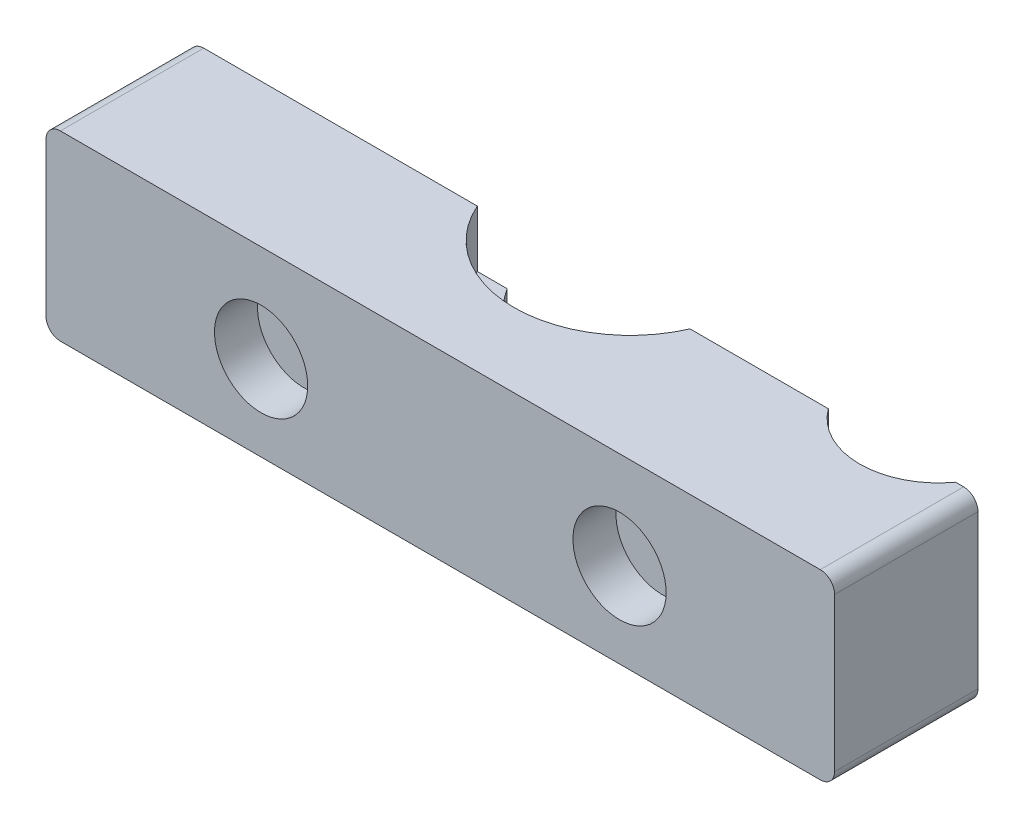
ISO-10303-21;
HEADER;
FILE_DESCRIPTION(('STEP AP214'),'2;1');
FILE_NAME('part.step','',(''),(''),'','','');
FILE_SCHEMA(('AUTOMOTIVE_DESIGN { 1 0 10303 214 1 1 1 1 }'));
ENDSEC;
DATA;
#1=APPLICATION_CONTEXT('core data for automotive mechanical design processes');
#2=APPLICATION_PROTOCOL_DEFINITION('international standard','automotive_design',2000,#1);
#3=PRODUCT_CONTEXT('',#1,'mechanical');
#4=PRODUCT('Part','Part','',(#3));
#5=PRODUCT_RELATED_PRODUCT_CATEGORY('part','',(#4));
#6=PRODUCT_DEFINITION_FORMATION('','',#4);
#7=PRODUCT_DEFINITION_CONTEXT('part definition',#1,'design');
#8=PRODUCT_DEFINITION('design','',#6,#7);
#9=PRODUCT_DEFINITION_SHAPE('','',#8);
#10=(LENGTH_UNIT() NAMED_UNIT(*) SI_UNIT(.MILLI.,.METRE.));
#11=(NAMED_UNIT(*) PLANE_ANGLE_UNIT() SI_UNIT($,.RADIAN.));
#12=(NAMED_UNIT(*) SI_UNIT($,.STERADIAN.) SOLID_ANGLE_UNIT());
#13=UNCERTAINTY_MEASURE_WITH_UNIT(LENGTH_MEASURE(1.E-05),#10,'distance_accuracy_value','');
#14=(GEOMETRIC_REPRESENTATION_CONTEXT(3) GLOBAL_UNCERTAINTY_ASSIGNED_CONTEXT((#13)) GLOBAL_UNIT_ASSIGNED_CONTEXT((#10,
#11,#12)) REPRESENTATION_CONTEXT('',''));
#15=CARTESIAN_POINT('',(0.,0.,0.));
#16=DIRECTION('',(0.,0.,1.));
#17=DIRECTION('',(1.,0.,0.));
#18=AXIS2_PLACEMENT_3D('',#15,#16,#17);
#19=CARTESIAN_POINT('',(26.5,-4.925,0.));
#20=DIRECTION('',(0.,0.,1.));
#21=DIRECTION('',(0.70710678118655,-0.707106781186546,0.));
#22=AXIS2_PLACEMENT_3D('',#19,#20,#21);
#23=CYLINDRICAL_SURFACE('',#22,1.);
#24=CARTESIAN_POINT('',(26.5,-4.925,10.));
#25=DIRECTION('',(0.,0.,-1.));
#26=DIRECTION('',(0.70710678118655,-0.707106781186546,0.));
#27=AXIS2_PLACEMENT_3D('',#24,#25,#26);
#28=CIRCLE('',#27,1.);
#29=CARTESIAN_POINT('',(27.5,-4.925,10.));
#30=VERTEX_POINT('',#29);
#31=CARTESIAN_POINT('',(26.5,-5.925,10.));
#32=VERTEX_POINT('',#31);
#33=EDGE_CURVE('E11',#30,#32,#28,.T.);
#34=ORIENTED_EDGE('',*,*,#33,.T.);
#35=DIRECTION('',(0.,0.,-1.));
#36=VECTOR('',#35,1.);
#37=CARTESIAN_POINT('',(26.5,-5.925,0.));
#38=LINE('',#37,#36);
#39=CARTESIAN_POINT('',(26.5,-5.925,0.));
#40=VERTEX_POINT('',#39);
#41=EDGE_CURVE('E27',#32,#40,#38,.T.);
#42=ORIENTED_EDGE('',*,*,#41,.T.);
#43=CARTESIAN_POINT('',(26.5,-4.925,0.));
#44=DIRECTION('',(0.,0.,1.));
#45=DIRECTION('',(0.70710678118655,-0.707106781186546,0.));
#46=AXIS2_PLACEMENT_3D('',#43,#44,#45);
#47=CIRCLE('',#46,1.);
#48=CARTESIAN_POINT('',(27.5,-4.925,0.));
#49=VERTEX_POINT('',#48);
#50=EDGE_CURVE('E398',#40,#49,#47,.T.);
#51=ORIENTED_EDGE('',*,*,#50,.T.);
#52=DIRECTION('',(0.,0.,1.));
#53=VECTOR('',#52,1.);
#54=CARTESIAN_POINT('',(27.5,-4.925,0.));
#55=LINE('',#54,#53);
#56=EDGE_CURVE('E193',#49,#30,#55,.T.);
#57=ORIENTED_EDGE('',*,*,#56,.T.);
#58=EDGE_LOOP('',(#34,#42,#51,#57));
#59=FACE_BOUND('',#58,.T.);
#60=ADVANCED_FACE('F17',(#59),#23,.T.);
#61=CARTESIAN_POINT('',(27.5,-5.925,0.));
#62=DIRECTION('',(1.,0.,0.));
#63=DIRECTION('',(0.,0.707106781186548,0.707106781186548));
#64=AXIS2_PLACEMENT_3D('',#61,#62,#63);
#65=PLANE('',#64);
#66=ORIENTED_EDGE('',*,*,#56,.F.);
#67=DIRECTION('',(0.,-1.,0.));
#68=VECTOR('',#67,1.);
#69=CARTESIAN_POINT('',(27.5,6.775,0.));
#70=LINE('',#69,#68);
#71=CARTESIAN_POINT('',(27.5,5.775,0.));
#72=VERTEX_POINT('',#71);
#73=EDGE_CURVE('E200',#72,#49,#70,.T.);
#74=ORIENTED_EDGE('',*,*,#73,.F.);
#75=DIRECTION('',(0.,0.,-1.));
#76=VECTOR('',#75,1.);
#77=CARTESIAN_POINT('',(27.5,5.775,0.));
#78=LINE('',#77,#76);
#79=CARTESIAN_POINT('',(27.5,5.775,10.));
#80=VERTEX_POINT('',#79);
#81=EDGE_CURVE('E188',#80,#72,#78,.T.);
#82=ORIENTED_EDGE('',*,*,#81,.F.);
#83=DIRECTION('',(0.,1.,0.));
#84=VECTOR('',#83,1.);
#85=CARTESIAN_POINT('',(27.5,6.775,10.));
#86=LINE('',#85,#84);
#87=EDGE_CURVE('E174',#30,#80,#86,.T.);
#88=ORIENTED_EDGE('',*,*,#87,.F.);
#89=EDGE_LOOP('',(#66,#74,#82,#88));
#90=FACE_BOUND('',#89,.T.);
#91=ADVANCED_FACE('F321',(#90),#65,.T.);
#92=CARTESIAN_POINT('',(0.,0.425,0.));
#93=DIRECTION('',(0.,0.,1.));
#94=DIRECTION('',(0.707106781186548,0.707106781186548,0.));
#95=AXIS2_PLACEMENT_3D('',#92,#93,#94);
#96=PLANE('',#95);
#97=ORIENTED_EDGE('',*,*,#50,.F.);
#98=DIRECTION('',(-1.,0.,0.));
#99=VECTOR('',#98,1.);
#100=CARTESIAN_POINT('',(27.5,-5.925,0.));
#101=LINE('',#100,#99);
#102=CARTESIAN_POINT('',(25.9370598373247,-5.925,0.));
#103=VERTEX_POINT('',#102);
#104=EDGE_CURVE('E190',#40,#103,#101,.T.);
#105=ORIENTED_EDGE('',*,*,#104,.T.);
#106=DIRECTION('',(0.,1.,0.));
#107=VECTOR('',#106,1.);
#108=CARTESIAN_POINT('',(25.9370598373247,6.775,0.));
#109=LINE('',#108,#107);
#110=CARTESIAN_POINT('',(25.9370598373247,6.775,0.));
#111=VERTEX_POINT('',#110);
#112=EDGE_CURVE('E194',#103,#111,#109,.T.);
#113=ORIENTED_EDGE('',*,*,#112,.T.);
#114=DIRECTION('',(1.,0.,0.));
#115=VECTOR('',#114,1.);
#116=CARTESIAN_POINT('',(-27.5,6.775,0.));
#117=LINE('',#116,#115);
#118=CARTESIAN_POINT('',(26.5,6.775,0.));
#119=VERTEX_POINT('',#118);
#120=EDGE_CURVE('E197',#111,#119,#117,.T.);
#121=ORIENTED_EDGE('',*,*,#120,.T.);
#122=CARTESIAN_POINT('',(26.5,5.775,0.));
#123=DIRECTION('',(0.,0.,1.));
#124=DIRECTION('',(0.707106781186546,0.707106781186549,0.));
#125=AXIS2_PLACEMENT_3D('',#122,#123,#124);
#126=CIRCLE('',#125,1.);
#127=EDGE_CURVE('E201',#72,#119,#126,.T.);
#128=ORIENTED_EDGE('',*,*,#127,.F.);
#129=ORIENTED_EDGE('',*,*,#73,.T.);
#130=EDGE_LOOP('',(#97,#105,#113,#121,#128,#129));
#131=FACE_BOUND('',#130,.T.);
#132=ADVANCED_FACE('F327',(#131),#96,.F.);
#133=CARTESIAN_POINT('',(26.5,5.775,0.));
#134=DIRECTION('',(0.,0.,1.));
#135=DIRECTION('',(0.707106781186546,0.707106781186549,0.));
#136=AXIS2_PLACEMENT_3D('',#133,#134,#135);
#137=CYLINDRICAL_SURFACE('',#136,1.);
#138=CARTESIAN_POINT('',(26.5,5.775,10.));
#139=DIRECTION('',(0.,0.,-1.));
#140=DIRECTION('',(0.707106781186546,0.707106781186549,0.));
#141=AXIS2_PLACEMENT_3D('',#138,#139,#140);
#142=CIRCLE('',#141,1.);
#143=CARTESIAN_POINT('',(26.5,6.775,10.));
#144=VERTEX_POINT('',#143);
#145=EDGE_CURVE('E204',#144,#80,#142,.T.);
#146=ORIENTED_EDGE('',*,*,#145,.T.);
#147=ORIENTED_EDGE('',*,*,#81,.T.);
#148=ORIENTED_EDGE('',*,*,#127,.T.);
#149=DIRECTION('',(0.,0.,1.));
#150=VECTOR('',#149,1.);
#151=CARTESIAN_POINT('',(26.5,6.775,0.));
#152=LINE('',#151,#150);
#153=EDGE_CURVE('E203',#119,#144,#152,.T.);
#154=ORIENTED_EDGE('',*,*,#153,.T.);
#155=EDGE_LOOP('',(#146,#147,#148,#154));
#156=FACE_BOUND('',#155,.T.);
#157=ADVANCED_FACE('F333',(#156),#137,.T.);
#158=CARTESIAN_POINT('',(-26.5,-4.925,0.));
#159=DIRECTION('',(0.,0.,1.));
#160=DIRECTION('',(-0.707106781186547,-0.707106781186549,0.));
#161=AXIS2_PLACEMENT_3D('',#158,#159,#160);
#162=CYLINDRICAL_SURFACE('',#161,1.);
#163=CARTESIAN_POINT('',(-26.5,-4.925,10.));
#164=DIRECTION('',(0.,0.,-1.));
#165=DIRECTION('',(-0.707106781186547,-0.707106781186549,0.));
#166=AXIS2_PLACEMENT_3D('',#163,#164,#165);
#167=CIRCLE('',#166,1.);
#168=CARTESIAN_POINT('',(-26.5,-5.925,10.));
#169=VERTEX_POINT('',#168);
#170=CARTESIAN_POINT('',(-27.5,-4.925,10.));
#171=VERTEX_POINT('',#170);
#172=EDGE_CURVE('E208',#169,#171,#167,.T.);
#173=ORIENTED_EDGE('',*,*,#172,.T.);
#174=DIRECTION('',(0.,0.,-1.));
#175=VECTOR('',#174,1.);
#176=CARTESIAN_POINT('',(-27.5,-4.925,0.));
#177=LINE('',#176,#175);
#178=CARTESIAN_POINT('',(-27.5,-4.925,0.));
#179=VERTEX_POINT('',#178);
#180=EDGE_CURVE('E211',#171,#179,#177,.T.);
#181=ORIENTED_EDGE('',*,*,#180,.T.);
#182=CARTESIAN_POINT('',(-26.5,-4.925,0.));
#183=DIRECTION('',(0.,0.,1.));
#184=DIRECTION('',(-0.707106781186547,-0.707106781186549,0.));
#185=AXIS2_PLACEMENT_3D('',#182,#183,#184);
#186=CIRCLE('',#185,1.);
#187=CARTESIAN_POINT('',(-26.5,-5.925,0.));
#188=VERTEX_POINT('',#187);
#189=EDGE_CURVE('E214',#179,#188,#186,.T.);
#190=ORIENTED_EDGE('',*,*,#189,.T.);
#191=DIRECTION('',(0.,0.,1.));
#192=VECTOR('',#191,1.);
#193=CARTESIAN_POINT('',(-26.5,-5.925,0.));
#194=LINE('',#193,#192);
#195=EDGE_CURVE('E217',#188,#169,#194,.T.);
#196=ORIENTED_EDGE('',*,*,#195,.T.);
#197=EDGE_LOOP('',(#173,#181,#190,#196));
#198=FACE_BOUND('',#197,.T.);
#199=ADVANCED_FACE('F337',(#198),#162,.T.);
#200=CARTESIAN_POINT('',(-27.5,-5.925,0.));
#201=DIRECTION('',(0.,-1.,0.));
#202=DIRECTION('',(0.707106781186548,0.,0.707106781186548));
#203=AXIS2_PLACEMENT_3D('',#200,#201,#202);
#204=PLANE('',#203);
#205=ORIENTED_EDGE('',*,*,#41,.F.);
#206=DIRECTION('',(1.,0.,0.));
#207=VECTOR('',#206,1.);
#208=CARTESIAN_POINT('',(27.5,-5.925,10.));
#209=LINE('',#208,#207);
#210=EDGE_CURVE('E159',#169,#32,#209,.T.);
#211=ORIENTED_EDGE('',*,*,#210,.F.);
#212=ORIENTED_EDGE('',*,*,#195,.F.);
#213=DIRECTION('',(-1.,0.,0.));
#214=VECTOR('',#213,1.);
#215=CARTESIAN_POINT('',(27.5,-5.925,0.));
#216=LINE('',#215,#214);
#217=CARTESIAN_POINT('',(-7.41940024530285,-5.925,0.));
#218=VERTEX_POINT('',#217);
#219=EDGE_CURVE('E222',#218,#188,#216,.T.);
#220=ORIENTED_EDGE('',*,*,#219,.F.);
#221=CARTESIAN_POINT('',(0.,-5.925,-3.25));
#222=DIRECTION('',(0.,1.,0.));
#223=DIRECTION('',(1.,0.,0.));
#224=AXIS2_PLACEMENT_3D('',#221,#222,#223);
#225=CIRCLE('',#224,8.1);
#226=CARTESIAN_POINT('',(7.41940024530285,-5.925,0.));
#227=VERTEX_POINT('',#226);
#228=EDGE_CURVE('E219',#218,#227,#225,.T.);
#229=ORIENTED_EDGE('',*,*,#228,.T.);
#230=DIRECTION('',(-1.,0.,0.));
#231=VECTOR('',#230,1.);
#232=CARTESIAN_POINT('',(27.5,-5.925,0.));
#233=LINE('',#232,#231);
#234=CARTESIAN_POINT('',(17.0629401626753,-5.925,0.));
#235=VERTEX_POINT('',#234);
#236=EDGE_CURVE('E230',#235,#227,#233,.T.);
#237=ORIENTED_EDGE('',*,*,#236,.F.);
#238=CARTESIAN_POINT('',(21.5,-5.925,-3.25));
#239=DIRECTION('',(0.,1.,0.));
#240=DIRECTION('',(-1.,0.,0.));
#241=AXIS2_PLACEMENT_3D('',#238,#239,#240);
#242=CIRCLE('',#241,5.5);
#243=EDGE_CURVE('E229',#235,#103,#242,.T.);
#244=ORIENTED_EDGE('',*,*,#243,.T.);
#245=ORIENTED_EDGE('',*,*,#104,.F.);
#246=EDGE_LOOP('',(#205,#211,#212,#220,#229,#237,#244,#245));
#247=FACE_BOUND('',#246,.T.);
#248=ADVANCED_FACE('F341',(#247),#204,.T.);
#249=CARTESIAN_POINT('',(0.,0.425,0.));
#250=DIRECTION('',(0.,0.,1.));
#251=DIRECTION('',(0.707106781186548,0.707106781186548,0.));
#252=AXIS2_PLACEMENT_3D('',#249,#250,#251);
#253=PLANE('',#252);
#254=CARTESIAN_POINT('',(-12.5,0.,0.));
#255=DIRECTION('',(0.,0.,1.));
#256=DIRECTION('',(1.,0.,0.));
#257=AXIS2_PLACEMENT_3D('',#254,#255,#256);
#258=CIRCLE('',#257,1.75);
#259=CARTESIAN_POINT('',(-14.25,0.,0.));
#260=VERTEX_POINT('',#259);
#261=EDGE_CURVE('E236',#260,#260,#258,.T.);
#262=ORIENTED_EDGE('',*,*,#261,.T.);
#263=EDGE_LOOP('',(#262));
#264=FACE_BOUND('',#263,.T.);
#265=ORIENTED_EDGE('',*,*,#189,.F.);
#266=DIRECTION('',(0.,1.,0.));
#267=VECTOR('',#266,1.);
#268=CARTESIAN_POINT('',(-27.5,-5.925,0.));
#269=LINE('',#268,#267);
#270=CARTESIAN_POINT('',(-27.5,5.775,0.));
#271=VERTEX_POINT('',#270);
#272=EDGE_CURVE('E239',#179,#271,#269,.T.);
#273=ORIENTED_EDGE('',*,*,#272,.T.);
#274=CARTESIAN_POINT('',(-26.5,5.775,0.));
#275=DIRECTION('',(0.,0.,1.));
#276=DIRECTION('',(-0.707106781186547,0.707106781186548,0.));
#277=AXIS2_PLACEMENT_3D('',#274,#275,#276);
#278=CIRCLE('',#277,1.);
#279=CARTESIAN_POINT('',(-26.5,6.775,0.));
#280=VERTEX_POINT('',#279);
#281=EDGE_CURVE('E243',#280,#271,#278,.T.);
#282=ORIENTED_EDGE('',*,*,#281,.F.);
#283=DIRECTION('',(1.,0.,0.));
#284=VECTOR('',#283,1.);
#285=CARTESIAN_POINT('',(-27.5,6.775,0.));
#286=LINE('',#285,#284);
#287=CARTESIAN_POINT('',(-7.41940024530285,6.775,0.));
#288=VERTEX_POINT('',#287);
#289=EDGE_CURVE('E242',#280,#288,#286,.T.);
#290=ORIENTED_EDGE('',*,*,#289,.T.);
#291=DIRECTION('',(0.,-1.,0.));
#292=VECTOR('',#291,1.);
#293=CARTESIAN_POINT('',(-7.41940024530285,4.8,0.));
#294=LINE('',#293,#292);
#295=CARTESIAN_POINT('',(-7.41940024530286,2.825,0.));
#296=VERTEX_POINT('',#295);
#297=EDGE_CURVE('E249',#288,#296,#294,.T.);
#298=ORIENTED_EDGE('',*,*,#297,.T.);
#299=DIRECTION('',(1.,0.,0.));
#300=VECTOR('',#299,1.);
#301=CARTESIAN_POINT('',(3.125,2.825,0.));
#302=LINE('',#301,#300);
#303=CARTESIAN_POINT('',(-5.33853912601566,2.825,0.));
#304=VERTEX_POINT('',#303);
#305=EDGE_CURVE('E252',#296,#304,#302,.T.);
#306=ORIENTED_EDGE('',*,*,#305,.T.);
#307=DIRECTION('',(0.,-1.,0.));
#308=VECTOR('',#307,1.);
#309=CARTESIAN_POINT('',(-5.33853912601566,0.,0.));
#310=LINE('',#309,#308);
#311=CARTESIAN_POINT('',(-5.33853912601566,-2.825,0.));
#312=VERTEX_POINT('',#311);
#313=EDGE_CURVE('E255',#304,#312,#310,.T.);
#314=ORIENTED_EDGE('',*,*,#313,.T.);
#315=DIRECTION('',(-1.,0.,0.));
#316=VECTOR('',#315,1.);
#317=CARTESIAN_POINT('',(4.05,-2.825,0.));
#318=LINE('',#317,#316);
#319=CARTESIAN_POINT('',(-7.41940024530285,-2.825,0.));
#320=VERTEX_POINT('',#319);
#321=EDGE_CURVE('E258',#312,#320,#318,.T.);
#322=ORIENTED_EDGE('',*,*,#321,.T.);
#323=DIRECTION('',(0.,-1.,0.));
#324=VECTOR('',#323,1.);
#325=CARTESIAN_POINT('',(-7.41940024530285,-4.375,0.));
#326=LINE('',#325,#324);
#327=EDGE_CURVE('E225',#320,#218,#326,.T.);
#328=ORIENTED_EDGE('',*,*,#327,.T.);
#329=ORIENTED_EDGE('',*,*,#219,.T.);
#330=EDGE_LOOP('',(#265,#273,#282,#290,#298,#306,#314,#322,#328,#329));
#331=FACE_BOUND('',#330,.T.);
#332=ADVANCED_FACE('F345',(#264,#331),#253,.F.);
#333=CARTESIAN_POINT('',(-26.5,5.775,0.));
#334=DIRECTION('',(0.,0.,1.));
#335=DIRECTION('',(-0.707106781186547,0.707106781186548,0.));
#336=AXIS2_PLACEMENT_3D('',#333,#334,#335);
#337=CYLINDRICAL_SURFACE('',#336,1.);
#338=CARTESIAN_POINT('',(-26.5,5.775,10.));
#339=DIRECTION('',(0.,0.,-1.));
#340=DIRECTION('',(-0.707106781186547,0.707106781186548,0.));
#341=AXIS2_PLACEMENT_3D('',#338,#339,#340);
#342=CIRCLE('',#341,1.);
#343=CARTESIAN_POINT('',(-27.5,5.775,10.));
#344=VERTEX_POINT('',#343);
#345=CARTESIAN_POINT('',(-26.5,6.775,10.));
#346=VERTEX_POINT('',#345);
#347=EDGE_CURVE('E226',#344,#346,#342,.T.);
#348=ORIENTED_EDGE('',*,*,#347,.T.);
#349=DIRECTION('',(0.,0.,-1.));
#350=VECTOR('',#349,1.);
#351=CARTESIAN_POINT('',(-26.5,6.775,0.));
#352=LINE('',#351,#350);
#353=EDGE_CURVE('E245',#346,#280,#352,.T.);
#354=ORIENTED_EDGE('',*,*,#353,.T.);
#355=ORIENTED_EDGE('',*,*,#281,.T.);
#356=DIRECTION('',(0.,0.,1.));
#357=VECTOR('',#356,1.);
#358=CARTESIAN_POINT('',(-27.5,5.775,0.));
#359=LINE('',#358,#357);
#360=EDGE_CURVE('E246',#271,#344,#359,.T.);
#361=ORIENTED_EDGE('',*,*,#360,.T.);
#362=EDGE_LOOP('',(#348,#354,#355,#361));
#363=FACE_BOUND('',#362,.T.);
#364=ADVANCED_FACE('F348',(#363),#337,.T.);
#365=CARTESIAN_POINT('',(27.5,6.775,0.));
#366=DIRECTION('',(0.,1.,0.));
#367=DIRECTION('',(0.707106781186548,0.,0.707106781186548));
#368=AXIS2_PLACEMENT_3D('',#365,#366,#367);
#369=PLANE('',#368);
#370=ORIENTED_EDGE('',*,*,#153,.F.);
#371=ORIENTED_EDGE('',*,*,#120,.F.);
#372=CARTESIAN_POINT('',(21.5,6.775,-3.25));
#373=DIRECTION('',(0.,-1.,0.));
#374=DIRECTION('',(-1.,0.,0.));
#375=AXIS2_PLACEMENT_3D('',#372,#373,#374);
#376=CIRCLE('',#375,5.5);
#377=CARTESIAN_POINT('',(17.0629401626753,6.775,0.));
#378=VERTEX_POINT('',#377);
#379=EDGE_CURVE('E268',#111,#378,#376,.T.);
#380=ORIENTED_EDGE('',*,*,#379,.T.);
#381=DIRECTION('',(1.,0.,0.));
#382=VECTOR('',#381,1.);
#383=CARTESIAN_POINT('',(-27.5,6.775,0.));
#384=LINE('',#383,#382);
#385=CARTESIAN_POINT('',(7.41940024530285,6.775,0.));
#386=VERTEX_POINT('',#385);
#387=EDGE_CURVE('E272',#386,#378,#384,.T.);
#388=ORIENTED_EDGE('',*,*,#387,.F.);
#389=CARTESIAN_POINT('',(0.,6.775,-3.25));
#390=DIRECTION('',(0.,-1.,0.));
#391=DIRECTION('',(1.,0.,0.));
#392=AXIS2_PLACEMENT_3D('',#389,#390,#391);
#393=CIRCLE('',#392,8.1);
#394=EDGE_CURVE('E271',#386,#288,#393,.T.);
#395=ORIENTED_EDGE('',*,*,#394,.T.);
#396=ORIENTED_EDGE('',*,*,#289,.F.);
#397=ORIENTED_EDGE('',*,*,#353,.F.);
#398=DIRECTION('',(-1.,0.,0.));
#399=VECTOR('',#398,1.);
#400=CARTESIAN_POINT('',(-27.5,6.775,10.));
#401=LINE('',#400,#399);
#402=EDGE_CURVE('E177',#144,#346,#401,.T.);
#403=ORIENTED_EDGE('',*,*,#402,.F.);
#404=EDGE_LOOP('',(#370,#371,#380,#388,#395,#396,#397,#403));
#405=FACE_BOUND('',#404,.T.);
#406=ADVANCED_FACE('F352',(#405),#369,.T.);
#407=CARTESIAN_POINT('',(-12.5,0.,6.6));
#408=DIRECTION('',(0.,0.,1.));
#409=DIRECTION('',(0.707106781186548,0.707106781186548,0.));
#410=AXIS2_PLACEMENT_3D('',#407,#408,#409);
#411=PLANE('',#410);
#412=CARTESIAN_POINT('',(-12.5,0.,6.6));
#413=DIRECTION('',(0.,0.,1.));
#414=DIRECTION('',(1.,0.,0.));
#415=AXIS2_PLACEMENT_3D('',#412,#413,#414);
#416=CIRCLE('',#415,1.75);
#417=CARTESIAN_POINT('',(-10.75,0.,6.6));
#418=VERTEX_POINT('',#417);
#419=EDGE_CURVE('E279',#418,#418,#416,.T.);
#420=ORIENTED_EDGE('',*,*,#419,.F.);
#421=EDGE_LOOP('',(#420));
#422=FACE_BOUND('',#421,.T.);
#423=ADVANCED_FACE('F356',(#422),#411,.F.);
#424=CARTESIAN_POINT('',(12.5,0.,6.6));
#425=DIRECTION('',(0.,0.,1.));
#426=DIRECTION('',(0.707106781186548,0.707106781186548,0.));
#427=AXIS2_PLACEMENT_3D('',#424,#425,#426);
#428=PLANE('',#427);
#429=CARTESIAN_POINT('',(12.5,0.,6.6));
#430=DIRECTION('',(0.,0.,1.));
#431=DIRECTION('',(1.,0.,0.));
#432=AXIS2_PLACEMENT_3D('',#429,#430,#431);
#433=CIRCLE('',#432,1.75);
#434=CARTESIAN_POINT('',(14.25,0.,6.6));
#435=VERTEX_POINT('',#434);
#436=EDGE_CURVE('E166',#435,#435,#433,.T.);
#437=ORIENTED_EDGE('',*,*,#436,.F.);
#438=EDGE_LOOP('',(#437));
#439=FACE_BOUND('',#438,.T.);
#440=ADVANCED_FACE('F360',(#439),#428,.F.);
#441=CARTESIAN_POINT('',(21.5,6.775,-3.25));
#442=DIRECTION('',(0.,-1.,0.));
#443=DIRECTION('',(-1.,0.,0.));
#444=AXIS2_PLACEMENT_3D('',#441,#442,#443);
#445=CYLINDRICAL_SURFACE('',#444,5.5);
#446=ORIENTED_EDGE('',*,*,#112,.F.);
#447=ORIENTED_EDGE('',*,*,#243,.F.);
#448=DIRECTION('',(0.,-1.,0.));
#449=VECTOR('',#448,1.);
#450=CARTESIAN_POINT('',(17.0629401626753,6.775,0.));
#451=LINE('',#450,#449);
#452=EDGE_CURVE('E232',#378,#235,#451,.T.);
#453=ORIENTED_EDGE('',*,*,#452,.F.);
#454=ORIENTED_EDGE('',*,*,#379,.F.);
#455=EDGE_LOOP('',(#446,#447,#453,#454));
#456=FACE_BOUND('',#455,.T.);
#457=ADVANCED_FACE('F364',(#456),#445,.F.);
#458=CARTESIAN_POINT('',(0.,0.425,0.));
#459=DIRECTION('',(0.,0.,1.));
#460=DIRECTION('',(0.707106781186548,0.707106781186548,0.));
#461=AXIS2_PLACEMENT_3D('',#458,#459,#460);
#462=PLANE('',#461);
#463=CARTESIAN_POINT('',(12.5,0.,0.));
#464=DIRECTION('',(0.,0.,1.));
#465=DIRECTION('',(1.,0.,0.));
#466=AXIS2_PLACEMENT_3D('',#463,#464,#465);
#467=CIRCLE('',#466,1.75);
#468=CARTESIAN_POINT('',(10.75,0.,0.));
#469=VERTEX_POINT('',#468);
#470=EDGE_CURVE('E277',#469,#469,#467,.T.);
#471=ORIENTED_EDGE('',*,*,#470,.T.);
#472=EDGE_LOOP('',(#471));
#473=FACE_BOUND('',#472,.T.);
#474=ORIENTED_EDGE('',*,*,#452,.T.);
#475=ORIENTED_EDGE('',*,*,#236,.T.);
#476=DIRECTION('',(0.,1.,0.));
#477=VECTOR('',#476,1.);
#478=CARTESIAN_POINT('',(7.41940024530285,-4.375,0.));
#479=LINE('',#478,#477);
#480=CARTESIAN_POINT('',(7.41940024530285,-2.825,0.));
#481=VERTEX_POINT('',#480);
#482=EDGE_CURVE('E233',#227,#481,#479,.T.);
#483=ORIENTED_EDGE('',*,*,#482,.T.);
#484=DIRECTION('',(-1.,0.,0.));
#485=VECTOR('',#484,1.);
#486=CARTESIAN_POINT('',(4.05,-2.825,0.));
#487=LINE('',#486,#485);
#488=CARTESIAN_POINT('',(5.33853912601566,-2.825,0.));
#489=VERTEX_POINT('',#488);
#490=EDGE_CURVE('E290',#481,#489,#487,.T.);
#491=ORIENTED_EDGE('',*,*,#490,.T.);
#492=DIRECTION('',(0.,1.,0.));
#493=VECTOR('',#492,1.);
#494=CARTESIAN_POINT('',(5.33853912601566,0.,0.));
#495=LINE('',#494,#493);
#496=CARTESIAN_POINT('',(5.33853912601566,2.825,0.));
#497=VERTEX_POINT('',#496);
#498=EDGE_CURVE('E293',#489,#497,#495,.T.);
#499=ORIENTED_EDGE('',*,*,#498,.T.);
#500=DIRECTION('',(1.,0.,0.));
#501=VECTOR('',#500,1.);
#502=CARTESIAN_POINT('',(3.125,2.825,0.));
#503=LINE('',#502,#501);
#504=CARTESIAN_POINT('',(7.41940024530286,2.825,0.));
#505=VERTEX_POINT('',#504);
#506=EDGE_CURVE('E296',#497,#505,#503,.T.);
#507=ORIENTED_EDGE('',*,*,#506,.T.);
#508=DIRECTION('',(0.,1.,0.));
#509=VECTOR('',#508,1.);
#510=CARTESIAN_POINT('',(7.41940024530285,4.8,0.));
#511=LINE('',#510,#509);
#512=EDGE_CURVE('E274',#505,#386,#511,.T.);
#513=ORIENTED_EDGE('',*,*,#512,.T.);
#514=ORIENTED_EDGE('',*,*,#387,.T.);
#515=EDGE_LOOP('',(#474,#475,#483,#491,#499,#507,#513,#514));
#516=FACE_BOUND('',#515,.T.);
#517=ADVANCED_FACE('F318',(#473,#516),#462,.F.);
#518=CARTESIAN_POINT('',(-12.5,0.,7.));
#519=DIRECTION('',(0.,0.,-1.));
#520=DIRECTION('',(0.707106781186548,0.707106781186548,0.));
#521=AXIS2_PLACEMENT_3D('',#518,#519,#520);
#522=PLANE('',#521);
#523=CARTESIAN_POINT('',(-12.5,0.,7.));
#524=DIRECTION('',(0.,0.,1.));
#525=DIRECTION('',(1.,0.,0.));
#526=AXIS2_PLACEMENT_3D('',#523,#524,#525);
#527=CIRCLE('',#526,3.25);
#528=CARTESIAN_POINT('',(-9.25,0.,7.));
#529=VERTEX_POINT('',#528);
#530=EDGE_CURVE('E275',#529,#529,#527,.T.);
#531=ORIENTED_EDGE('',*,*,#530,.T.);
#532=EDGE_LOOP('',(#531));
#533=FACE_BOUND('',#532,.T.);
#534=ADVANCED_FACE('F303',(#533),#522,.F.);
#535=CARTESIAN_POINT('',(-12.5,0.,8.5));
#536=DIRECTION('',(0.,0.,1.));
#537=DIRECTION('',(1.,0.,0.));
#538=AXIS2_PLACEMENT_3D('',#535,#536,#537);
#539=CYLINDRICAL_SURFACE('',#538,3.25);
#540=CARTESIAN_POINT('',(-12.5,0.,10.));
#541=DIRECTION('',(0.,0.,-1.));
#542=DIRECTION('',(1.,0.,0.));
#543=AXIS2_PLACEMENT_3D('',#540,#541,#542);
#544=CIRCLE('',#543,3.25);
#545=CARTESIAN_POINT('',(-9.25,0.,10.));
#546=VERTEX_POINT('',#545);
#547=EDGE_CURVE('E156',#546,#546,#544,.T.);
#548=ORIENTED_EDGE('',*,*,#547,.F.);
#549=EDGE_LOOP('',(#548));
#550=FACE_BOUND('',#549,.T.);
#551=ORIENTED_EDGE('',*,*,#530,.F.);
#552=EDGE_LOOP('',(#551));
#553=FACE_BOUND('',#552,.T.);
#554=ADVANCED_FACE('F305',(#550,#553),#539,.F.);
#555=CARTESIAN_POINT('',(-12.5,0.,-47.3261720333741));
#556=DIRECTION('',(0.,0.,1.));
#557=DIRECTION('',(1.,0.,0.));
#558=AXIS2_PLACEMENT_3D('',#555,#556,#557);
#559=CYLINDRICAL_SURFACE('',#558,1.75);
#560=ORIENTED_EDGE('',*,*,#419,.T.);
#561=EDGE_LOOP('',(#560));
#562=FACE_BOUND('',#561,.T.);
#563=ORIENTED_EDGE('',*,*,#261,.F.);
#564=EDGE_LOOP('',(#563));
#565=FACE_BOUND('',#564,.T.);
#566=ADVANCED_FACE('F307',(#562,#565),#559,.F.);
#567=CARTESIAN_POINT('',(12.5,0.,7.));
#568=DIRECTION('',(0.,0.,-1.));
#569=DIRECTION('',(0.707106781186548,0.707106781186548,0.));
#570=AXIS2_PLACEMENT_3D('',#567,#568,#569);
#571=PLANE('',#570);
#572=CARTESIAN_POINT('',(12.5,0.,7.));
#573=DIRECTION('',(0.,0.,1.));
#574=DIRECTION('',(1.,0.,0.));
#575=AXIS2_PLACEMENT_3D('',#572,#573,#574);
#576=CIRCLE('',#575,3.25);
#577=CARTESIAN_POINT('',(15.75,0.,7.));
#578=VERTEX_POINT('',#577);
#579=EDGE_CURVE('E149',#578,#578,#576,.T.);
#580=ORIENTED_EDGE('',*,*,#579,.T.);
#581=EDGE_LOOP('',(#580));
#582=FACE_BOUND('',#581,.T.);
#583=ADVANCED_FACE('F315',(#582),#571,.F.);
#584=CARTESIAN_POINT('',(12.5,0.,8.5));
#585=DIRECTION('',(0.,0.,1.));
#586=DIRECTION('',(1.,0.,0.));
#587=AXIS2_PLACEMENT_3D('',#584,#585,#586);
#588=CYLINDRICAL_SURFACE('',#587,3.25);
#589=CARTESIAN_POINT('',(12.5,0.,10.));
#590=DIRECTION('',(0.,0.,-1.));
#591=DIRECTION('',(1.,0.,0.));
#592=AXIS2_PLACEMENT_3D('',#589,#590,#591);
#593=CIRCLE('',#592,3.25);
#594=CARTESIAN_POINT('',(15.75,0.,10.));
#595=VERTEX_POINT('',#594);
#596=EDGE_CURVE('E153',#595,#595,#593,.T.);
#597=ORIENTED_EDGE('',*,*,#596,.F.);
#598=EDGE_LOOP('',(#597));
#599=FACE_BOUND('',#598,.T.);
#600=ORIENTED_EDGE('',*,*,#579,.F.);
#601=EDGE_LOOP('',(#600));
#602=FACE_BOUND('',#601,.T.);
#603=ADVANCED_FACE('F154',(#599,#602),#588,.F.);
#604=CARTESIAN_POINT('',(12.5,0.,-47.3261720333741));
#605=DIRECTION('',(0.,0.,1.));
#606=DIRECTION('',(1.,0.,0.));
#607=AXIS2_PLACEMENT_3D('',#604,#605,#606);
#608=CYLINDRICAL_SURFACE('',#607,1.75);
#609=ORIENTED_EDGE('',*,*,#436,.T.);
#610=EDGE_LOOP('',(#609));
#611=FACE_BOUND('',#610,.T.);
#612=ORIENTED_EDGE('',*,*,#470,.F.);
#613=EDGE_LOOP('',(#612));
#614=FACE_BOUND('',#613,.T.);
#615=ADVANCED_FACE('F429',(#611,#614),#608,.F.);
#616=CARTESIAN_POINT('',(0.,4.8,-3.25));
#617=DIRECTION('',(0.,-1.,0.));
#618=DIRECTION('',(1.,0.,0.));
#619=AXIS2_PLACEMENT_3D('',#616,#617,#618);
#620=CYLINDRICAL_SURFACE('',#619,8.1);
#621=ORIENTED_EDGE('',*,*,#512,.F.);
#622=CARTESIAN_POINT('',(0.,2.825,-3.25));
#623=DIRECTION('',(0.,-1.,0.));
#624=DIRECTION('',(1.,0.,0.));
#625=AXIS2_PLACEMENT_3D('',#622,#623,#624);
#626=CIRCLE('',#625,8.1);
#627=EDGE_CURVE('E163',#505,#296,#626,.T.);
#628=ORIENTED_EDGE('',*,*,#627,.T.);
#629=ORIENTED_EDGE('',*,*,#297,.F.);
#630=ORIENTED_EDGE('',*,*,#394,.F.);
#631=EDGE_LOOP('',(#621,#628,#629,#630));
#632=FACE_BOUND('',#631,.T.);
#633=ADVANCED_FACE('F391',(#632),#620,.F.);
#634=CARTESIAN_POINT('',(6.25,2.825,-3.25));
#635=DIRECTION('',(0.,-1.,0.));
#636=DIRECTION('',(0.707106781186548,0.,0.707106781186548));
#637=AXIS2_PLACEMENT_3D('',#634,#635,#636);
#638=PLANE('',#637);
#639=ORIENTED_EDGE('',*,*,#506,.F.);
#640=CARTESIAN_POINT('',(0.,2.825,-3.25));
#641=DIRECTION('',(0.,-1.,0.));
#642=DIRECTION('',(1.,0.,0.));
#643=AXIS2_PLACEMENT_3D('',#640,#641,#642);
#644=CIRCLE('',#643,6.25);
#645=EDGE_CURVE('E167',#497,#304,#644,.T.);
#646=ORIENTED_EDGE('',*,*,#645,.T.);
#647=ORIENTED_EDGE('',*,*,#305,.F.);
#648=ORIENTED_EDGE('',*,*,#627,.F.);
#649=EDGE_LOOP('',(#639,#646,#647,#648));
#650=FACE_BOUND('',#649,.T.);
#651=ADVANCED_FACE('F387',(#650),#638,.F.);
#652=CARTESIAN_POINT('',(0.,0.,-3.25));
#653=DIRECTION('',(0.,-1.,0.));
#654=DIRECTION('',(1.,0.,0.));
#655=AXIS2_PLACEMENT_3D('',#652,#653,#654);
#656=CYLINDRICAL_SURFACE('',#655,6.25);
#657=ORIENTED_EDGE('',*,*,#498,.F.);
#658=CARTESIAN_POINT('',(0.,-2.825,-3.25));
#659=DIRECTION('',(0.,-1.,0.));
#660=DIRECTION('',(1.,0.,0.));
#661=AXIS2_PLACEMENT_3D('',#658,#659,#660);
#662=CIRCLE('',#661,6.25);
#663=EDGE_CURVE('E170',#489,#312,#662,.T.);
#664=ORIENTED_EDGE('',*,*,#663,.T.);
#665=ORIENTED_EDGE('',*,*,#313,.F.);
#666=ORIENTED_EDGE('',*,*,#645,.F.);
#667=EDGE_LOOP('',(#657,#664,#665,#666));
#668=FACE_BOUND('',#667,.T.);
#669=ADVANCED_FACE('F385',(#668),#656,.F.);
#670=CARTESIAN_POINT('',(8.1,-2.825,-3.25));
#671=DIRECTION('',(0.,1.,0.));
#672=DIRECTION('',(0.707106781186548,0.,0.707106781186548));
#673=AXIS2_PLACEMENT_3D('',#670,#671,#672);
#674=PLANE('',#673);
#675=ORIENTED_EDGE('',*,*,#490,.F.);
#676=CARTESIAN_POINT('',(0.,-2.825,-3.25));
#677=DIRECTION('',(0.,-1.,0.));
#678=DIRECTION('',(1.,0.,0.));
#679=AXIS2_PLACEMENT_3D('',#676,#677,#678);
#680=CIRCLE('',#679,8.1);
#681=EDGE_CURVE('E172',#481,#320,#680,.T.);
#682=ORIENTED_EDGE('',*,*,#681,.T.);
#683=ORIENTED_EDGE('',*,*,#321,.F.);
#684=ORIENTED_EDGE('',*,*,#663,.F.);
#685=EDGE_LOOP('',(#675,#682,#683,#684));
#686=FACE_BOUND('',#685,.T.);
#687=ADVANCED_FACE('F383',(#686),#674,.F.);
#688=CARTESIAN_POINT('',(0.,-4.375,-3.25));
#689=DIRECTION('',(0.,-1.,0.));
#690=DIRECTION('',(1.,0.,0.));
#691=AXIS2_PLACEMENT_3D('',#688,#689,#690);
#692=CYLINDRICAL_SURFACE('',#691,8.1);
#693=ORIENTED_EDGE('',*,*,#482,.F.);
#694=ORIENTED_EDGE('',*,*,#228,.F.);
#695=ORIENTED_EDGE('',*,*,#327,.F.);
#696=ORIENTED_EDGE('',*,*,#681,.F.);
#697=EDGE_LOOP('',(#693,#694,#695,#696));
#698=FACE_BOUND('',#697,.T.);
#699=ADVANCED_FACE('F380',(#698),#692,.F.);
#700=CARTESIAN_POINT('',(-27.5,6.775,0.));
#701=DIRECTION('',(-1.,0.,0.));
#702=DIRECTION('',(0.,0.707106781186548,0.707106781186548));
#703=AXIS2_PLACEMENT_3D('',#700,#701,#702);
#704=PLANE('',#703);
#705=ORIENTED_EDGE('',*,*,#180,.F.);
#706=DIRECTION('',(0.,-1.,0.));
#707=VECTOR('',#706,1.);
#708=CARTESIAN_POINT('',(-27.5,-5.925,10.));
#709=LINE('',#708,#707);
#710=EDGE_CURVE('E21',#344,#171,#709,.T.);
#711=ORIENTED_EDGE('',*,*,#710,.F.);
#712=ORIENTED_EDGE('',*,*,#360,.F.);
#713=ORIENTED_EDGE('',*,*,#272,.F.);
#714=EDGE_LOOP('',(#705,#711,#712,#713));
#715=FACE_BOUND('',#714,.T.);
#716=ADVANCED_FACE('F411',(#715),#704,.T.);
#717=CARTESIAN_POINT('',(0.,0.425,10.));
#718=DIRECTION('',(0.,0.,1.));
#719=DIRECTION('',(0.707106781186548,0.707106781186548,0.));
#720=AXIS2_PLACEMENT_3D('',#717,#718,#719);
#721=PLANE('',#720);
#722=ORIENTED_EDGE('',*,*,#33,.F.);
#723=ORIENTED_EDGE('',*,*,#87,.T.);
#724=ORIENTED_EDGE('',*,*,#145,.F.);
#725=ORIENTED_EDGE('',*,*,#402,.T.);
#726=ORIENTED_EDGE('',*,*,#347,.F.);
#727=ORIENTED_EDGE('',*,*,#710,.T.);
#728=ORIENTED_EDGE('',*,*,#172,.F.);
#729=ORIENTED_EDGE('',*,*,#210,.T.);
#730=EDGE_LOOP('',(#722,#723,#724,#725,#726,#727,#728,#729));
#731=FACE_BOUND('',#730,.T.);
#732=ORIENTED_EDGE('',*,*,#547,.T.);
#733=EDGE_LOOP('',(#732));
#734=FACE_BOUND('',#733,.T.);
#735=ORIENTED_EDGE('',*,*,#596,.T.);
#736=EDGE_LOOP('',(#735));
#737=FACE_BOUND('',#736,.T.);
#738=ADVANCED_FACE('F19',(#731,#734,#737),#721,.T.);
#739=CLOSED_SHELL('',(#60,#91,#132,#157,#199,#248,#332,#364,#406,#423,#440,#457,#517,#534,#554,
#566,#583,#603,#615,#633,#651,#669,#687,#699,#716,#738));
#740=MANIFOLD_SOLID_BREP('B1',#739);
#741=ADVANCED_BREP_SHAPE_REPRESENTATION('',(#18,#740),#14);
#742=SHAPE_DEFINITION_REPRESENTATION(#9,#741);
ENDSEC;
END-ISO-10303-21;
